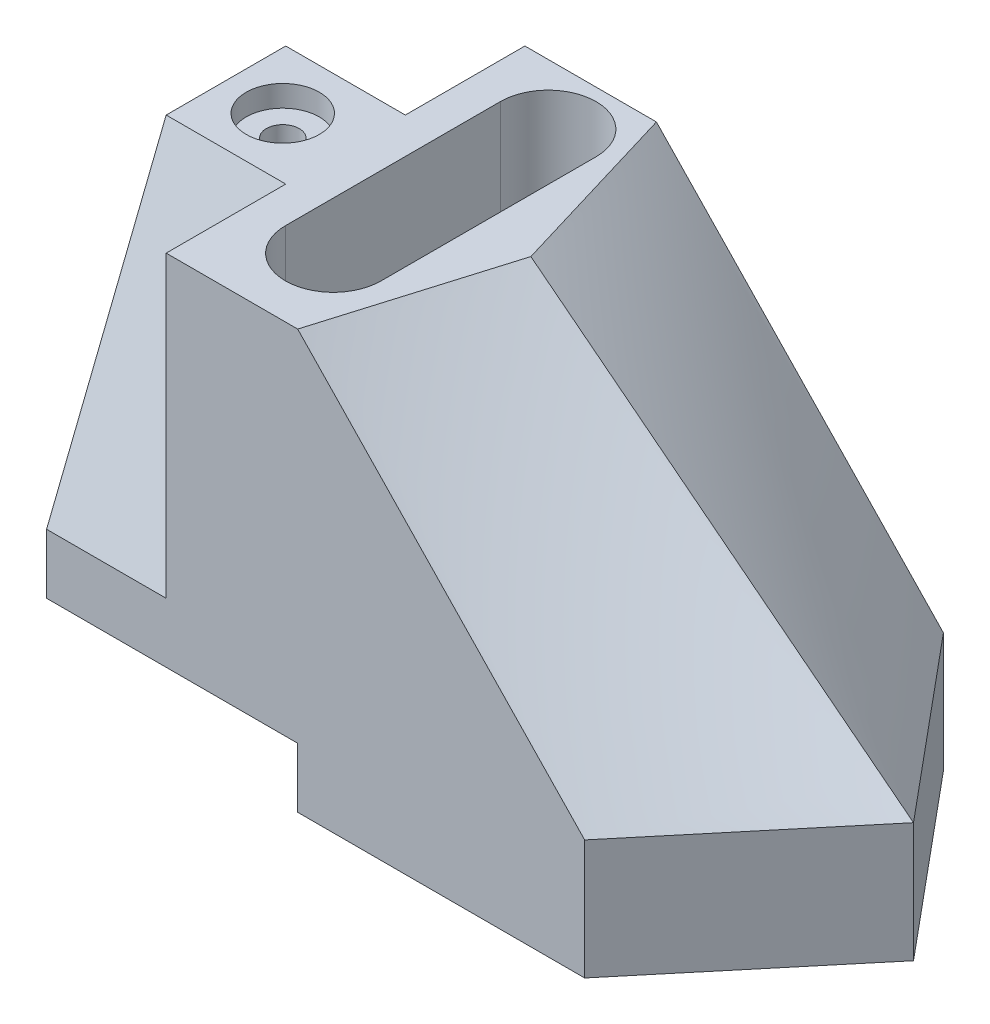
ISO-10303-21;
HEADER;
FILE_DESCRIPTION(('STEP AP214'),'2;1');
FILE_NAME('part.step','',(''),(''),'','','');
FILE_SCHEMA(('AUTOMOTIVE_DESIGN { 1 0 10303 214 1 1 1 1 }'));
ENDSEC;
DATA;
#1=APPLICATION_CONTEXT('core data for automotive mechanical design processes');
#2=APPLICATION_PROTOCOL_DEFINITION('international standard','automotive_design',2000,#1);
#3=PRODUCT_CONTEXT('',#1,'mechanical');
#4=PRODUCT('Part','Part','',(#3));
#5=PRODUCT_RELATED_PRODUCT_CATEGORY('part','',(#4));
#6=PRODUCT_DEFINITION_FORMATION('','',#4);
#7=PRODUCT_DEFINITION_CONTEXT('part definition',#1,'design');
#8=PRODUCT_DEFINITION('design','',#6,#7);
#9=PRODUCT_DEFINITION_SHAPE('','',#8);
#10=(LENGTH_UNIT() NAMED_UNIT(*) SI_UNIT(.MILLI.,.METRE.));
#11=(NAMED_UNIT(*) PLANE_ANGLE_UNIT() SI_UNIT($,.RADIAN.));
#12=(NAMED_UNIT(*) SI_UNIT($,.STERADIAN.) SOLID_ANGLE_UNIT());
#13=UNCERTAINTY_MEASURE_WITH_UNIT(LENGTH_MEASURE(1.E-05),#10,'distance_accuracy_value','');
#14=(GEOMETRIC_REPRESENTATION_CONTEXT(3) GLOBAL_UNCERTAINTY_ASSIGNED_CONTEXT((#13)) GLOBAL_UNIT_ASSIGNED_CONTEXT((#10,
#11,#12)) REPRESENTATION_CONTEXT('',''));
#15=CARTESIAN_POINT('',(0.,0.,0.));
#16=DIRECTION('',(0.,0.,1.));
#17=DIRECTION('',(1.,0.,0.));
#18=AXIS2_PLACEMENT_3D('',#15,#16,#17);
#19=CARTESIAN_POINT('',(0.,13.1034482758621,32.7586206896553));
#20=DIRECTION('',(0.,-0.371390676354103,-0.928476690885259));
#21=DIRECTION('',(0.,0.92847669088526,-0.371390676354104));
#22=AXIS2_PLACEMENT_3D('',#19,#20,#21);
#23=PLANE('',#22);
#24=DIRECTION('',(0.,-0.92847669088526,0.371390676354104));
#25=VECTOR('',#24,1.);
#26=CARTESIAN_POINT('',(-94.9999999999999,13.1034482758621,32.7586206896553));
#27=LINE('',#26,#25);
#28=CARTESIAN_POINT('',(-94.9999999999999,70.,10.0000000000002));
#29=VERTEX_POINT('',#28);
#30=CARTESIAN_POINT('',(-94.9999999999999,20.,30.0000000000002));
#31=VERTEX_POINT('',#30);
#32=EDGE_CURVE('E336',#29,#31,#27,.T.);
#33=ORIENTED_EDGE('',*,*,#32,.F.);
#34=DIRECTION('',(1.,0.,0.));
#35=VECTOR('',#34,1.);
#36=CARTESIAN_POINT('',(-115.,70.,10.0000000000002));
#37=LINE('',#36,#35);
#38=CARTESIAN_POINT('',(-115.,70.,10.0000000000002));
#39=VERTEX_POINT('',#38);
#40=EDGE_CURVE('E435',#39,#29,#37,.T.);
#41=ORIENTED_EDGE('',*,*,#40,.F.);
#42=DIRECTION('',(0.,0.928476690885259,-0.371390676354104));
#43=VECTOR('',#42,1.);
#44=CARTESIAN_POINT('',(-115.,20.,30.0000000000002));
#45=LINE('',#44,#43);
#46=CARTESIAN_POINT('',(-115.,20.,30.0000000000002));
#47=VERTEX_POINT('',#46);
#48=EDGE_CURVE('E339',#47,#39,#45,.T.);
#49=ORIENTED_EDGE('',*,*,#48,.F.);
#50=DIRECTION('',(-1.,0.,0.));
#51=VECTOR('',#50,1.);
#52=CARTESIAN_POINT('',(-24.9999999999999,20.,30.0000000000002));
#53=LINE('',#52,#51);
#54=EDGE_CURVE('E468',#31,#47,#53,.T.);
#55=ORIENTED_EDGE('',*,*,#54,.F.);
#56=EDGE_LOOP('',(#33,#41,#49,#55));
#57=FACE_BOUND('',#56,.T.);
#58=ADVANCED_FACE('F93',(#57),#23,.F.);
#59=CARTESIAN_POINT('',(0.,13.103448275862,-32.758620689655));
#60=DIRECTION('',(0.,-0.371390676354104,0.928476690885259));
#61=DIRECTION('',(0.,-0.928476690885259,-0.371390676354104));
#62=AXIS2_PLACEMENT_3D('',#59,#60,#61);
#63=PLANE('',#62);
#64=DIRECTION('',(0.,0.928476690885259,0.371390676354104));
#65=VECTOR('',#64,1.);
#66=CARTESIAN_POINT('',(-94.9999999999999,13.103448275862,-32.758620689655));
#67=LINE('',#66,#65);
#68=CARTESIAN_POINT('',(-94.9999999999999,20.,-29.9999999999998));
#69=VERTEX_POINT('',#68);
#70=CARTESIAN_POINT('',(-94.9999999999999,70.,-9.99999999999981));
#71=VERTEX_POINT('',#70);
#72=EDGE_CURVE('E12',#69,#71,#67,.T.);
#73=ORIENTED_EDGE('',*,*,#72,.F.);
#74=DIRECTION('',(1.,0.,0.));
#75=VECTOR('',#74,1.);
#76=CARTESIAN_POINT('',(-115.,20.,-29.9999999999998));
#77=LINE('',#76,#75);
#78=CARTESIAN_POINT('',(-115.,20.,-29.9999999999998));
#79=VERTEX_POINT('',#78);
#80=EDGE_CURVE('E473',#79,#69,#77,.T.);
#81=ORIENTED_EDGE('',*,*,#80,.F.);
#82=DIRECTION('',(0.,0.928476690885259,0.371390676354104));
#83=VECTOR('',#82,1.);
#84=CARTESIAN_POINT('',(-115.,20.,-29.9999999999998));
#85=LINE('',#84,#83);
#86=CARTESIAN_POINT('',(-115.,70.,-9.9999999999998));
#87=VERTEX_POINT('',#86);
#88=EDGE_CURVE('E344',#79,#87,#85,.T.);
#89=ORIENTED_EDGE('',*,*,#88,.T.);
#90=DIRECTION('',(-1.,0.,0.));
#91=VECTOR('',#90,1.);
#92=CARTESIAN_POINT('',(-94.9999999999999,70.,-9.99999999999981));
#93=LINE('',#92,#91);
#94=EDGE_CURVE('E98',#71,#87,#93,.T.);
#95=ORIENTED_EDGE('',*,*,#94,.F.);
#96=EDGE_LOOP('',(#73,#81,#89,#95));
#97=FACE_BOUND('',#96,.T.);
#98=ADVANCED_FACE('F362',(#97),#63,.F.);
#99=CARTESIAN_POINT('',(0.,70.,0.));
#100=DIRECTION('',(0.,-1.,0.));
#101=DIRECTION('',(0.,0.,-1.));
#102=AXIS2_PLACEMENT_3D('',#99,#100,#101);
#103=PLANE('',#102);
#104=CARTESIAN_POINT('',(-105.49695016561,70.,0.));
#105=DIRECTION('',(0.,1.,0.));
#106=DIRECTION('',(0.,0.,1.));
#107=AXIS2_PLACEMENT_3D('',#104,#105,#106);
#108=CIRCLE('',#107,6.11999995199999);
#109=CARTESIAN_POINT('',(-105.49695016561,70.,6.11999995199999));
#110=VERTEX_POINT('',#109);
#111=EDGE_CURVE('E885',#110,#110,#108,.T.);
#112=ORIENTED_EDGE('',*,*,#111,.F.);
#113=EDGE_LOOP('',(#112));
#114=FACE_BOUND('',#113,.T.);
#115=CARTESIAN_POINT('',(-80.9999999999999,70.,16.0525342275668));
#116=DIRECTION('',(0.,1.,0.));
#117=DIRECTION('',(0.,0.,1.));
#118=AXIS2_PLACEMENT_3D('',#115,#116,#117);
#119=CIRCLE('',#118,7.99999999999999);
#120=CARTESIAN_POINT('',(-88.9999999999999,70.,16.0525342275668));
#121=VERTEX_POINT('',#120);
#122=CARTESIAN_POINT('',(-72.9999999999999,70.,16.0525342275668));
#123=VERTEX_POINT('',#122);
#124=EDGE_CURVE('E320',#121,#123,#119,.T.);
#125=ORIENTED_EDGE('',*,*,#124,.F.);
#126=DIRECTION('',(0.,0.,1.));
#127=VECTOR('',#126,1.);
#128=CARTESIAN_POINT('',(-88.9999999999999,70.,0.));
#129=LINE('',#128,#127);
#130=CARTESIAN_POINT('',(-88.9999999999999,70.,-19.9033630066877));
#131=VERTEX_POINT('',#130);
#132=EDGE_CURVE('E120',#131,#121,#129,.T.);
#133=ORIENTED_EDGE('',*,*,#132,.F.);
#134=CARTESIAN_POINT('',(-80.9999999999999,70.,-19.9033630066877));
#135=DIRECTION('',(0.,1.,0.));
#136=DIRECTION('',(0.,0.,1.));
#137=AXIS2_PLACEMENT_3D('',#134,#135,#136);
#138=CIRCLE('',#137,7.99999999999999);
#139=CARTESIAN_POINT('',(-72.9999999999999,70.,-19.9033630066877));
#140=VERTEX_POINT('',#139);
#141=EDGE_CURVE('E299',#140,#131,#138,.T.);
#142=ORIENTED_EDGE('',*,*,#141,.F.);
#143=DIRECTION('',(0.,0.,-1.));
#144=VECTOR('',#143,1.);
#145=CARTESIAN_POINT('',(-72.9999999999999,70.,0.));
#146=LINE('',#145,#144);
#147=EDGE_CURVE('E323',#123,#140,#146,.T.);
#148=ORIENTED_EDGE('',*,*,#147,.F.);
#149=EDGE_LOOP('',(#125,#133,#142,#148));
#150=FACE_BOUND('',#149,.T.);
#151=DIRECTION('',(0.,0.,1.));
#152=VECTOR('',#151,1.);
#153=CARTESIAN_POINT('',(-94.9999999999999,70.,-29.9999999999998));
#154=LINE('',#153,#152);
#155=CARTESIAN_POINT('',(-94.9999999999999,70.,-29.9999999999998));
#156=VERTEX_POINT('',#155);
#157=EDGE_CURVE('E493',#156,#71,#154,.T.);
#158=ORIENTED_EDGE('',*,*,#157,.T.);
#159=ORIENTED_EDGE('',*,*,#94,.T.);
#160=DIRECTION('',(0.,0.,1.));
#161=VECTOR('',#160,1.);
#162=CARTESIAN_POINT('',(-115.,70.,-9.9999999999998));
#163=LINE('',#162,#161);
#164=EDGE_CURVE('E348',#87,#39,#163,.T.);
#165=ORIENTED_EDGE('',*,*,#164,.T.);
#166=ORIENTED_EDGE('',*,*,#40,.T.);
#167=CARTESIAN_POINT('',(-94.9999999999999,70.,30.0000000000002));
#168=VERTEX_POINT('',#167);
#169=EDGE_CURVE('E605',#29,#168,#154,.T.);
#170=ORIENTED_EDGE('',*,*,#169,.T.);
#171=DIRECTION('',(1.,0.,0.));
#172=VECTOR('',#171,1.);
#173=CARTESIAN_POINT('',(-94.9999999999999,70.,30.0000000000002));
#174=LINE('',#173,#172);
#175=CARTESIAN_POINT('',(-72.9999999999999,70.,30.0000000000002));
#176=VERTEX_POINT('',#175);
#177=EDGE_CURVE('E472',#168,#176,#174,.T.);
#178=ORIENTED_EDGE('',*,*,#177,.T.);
#179=DIRECTION('',(0.287347885566345,0.,-0.957826285221152));
#180=VECTOR('',#179,1.);
#181=CARTESIAN_POINT('',(-72.9999999999999,70.,30.0000000000002));
#182=LINE('',#181,#180);
#183=CARTESIAN_POINT('',(-63.9999999999999,70.,1.97758476261356E-13));
#184=VERTEX_POINT('',#183);
#185=EDGE_CURVE('E554',#176,#184,#182,.T.);
#186=ORIENTED_EDGE('',*,*,#185,.T.);
#187=DIRECTION('',(-0.287347885566345,0.,-0.957826285221152));
#188=VECTOR('',#187,1.);
#189=CARTESIAN_POINT('',(-63.9999999999999,70.,1.93421667571414E-13));
#190=LINE('',#189,#188);
#191=CARTESIAN_POINT('',(-72.9999999999999,70.,-29.9999999999998));
#192=VERTEX_POINT('',#191);
#193=EDGE_CURVE('E543',#184,#192,#190,.T.);
#194=ORIENTED_EDGE('',*,*,#193,.T.);
#195=DIRECTION('',(-1.,0.,0.));
#196=VECTOR('',#195,1.);
#197=CARTESIAN_POINT('',(-72.9999999999999,70.,-29.9999999999998));
#198=LINE('',#197,#196);
#199=EDGE_CURVE('E553',#192,#156,#198,.T.);
#200=ORIENTED_EDGE('',*,*,#199,.T.);
#201=EDGE_LOOP('',(#158,#159,#165,#166,#170,#178,#186,#194,#200));
#202=FACE_BOUND('',#201,.T.);
#203=ADVANCED_FACE('F95',(#114,#150,#202),#103,.F.);
#204=CARTESIAN_POINT('',(-24.9999999999999,20.,30.0000000000002));
#205=CARTESIAN_POINT('',(-72.9999999999999,70.,30.0000000000002));
#206=CARTESIAN_POINT('',(0.,20.,0.));
#207=CARTESIAN_POINT('',(-63.9999999999999,70.,1.97758476261356E-13));
#208=B_SPLINE_SURFACE_WITH_KNOTS('',1,1,((#204,#205),(#206,#207)),.UNSPECIFIED.,.F.,.F.,.F.,(2,
2),(2,2),(0.,1.),(0.,1.),.UNSPECIFIED.);
#209=DIRECTION('',(0.640184399664476,0.,-0.768221279597379));
#210=VECTOR('',#209,1.);
#211=CARTESIAN_POINT('',(0.,20.,0.));
#212=LINE('',#211,#210);
#213=CARTESIAN_POINT('',(-24.9999999999999,20.,30.0000000000002));
#214=VERTEX_POINT('',#213);
#215=CARTESIAN_POINT('',(0.,20.,0.));
#216=VERTEX_POINT('',#215);
#217=EDGE_CURVE('E412',#214,#216,#212,.T.);
#218=DIRECTION('',(-0.788024373724563,0.615644041972316,0.));
#219=VECTOR('',#218,1.);
#220=CARTESIAN_POINT('',(-32.,45.,0.));
#221=LINE('',#220,#219);
#222=EDGE_CURVE('E428',#216,#184,#221,.T.);
#223=DIRECTION('',(0.692531828189713,-0.721387321030952,0.));
#224=VECTOR('',#223,1.);
#225=CARTESIAN_POINT('',(-48.9999999999999,45.,30.0000000000002));
#226=LINE('',#225,#224);
#227=EDGE_CURVE('E492',#176,#214,#226,.T.);
#228=ORIENTED_EDGE('',*,*,#217,.T.);
#229=ORIENTED_EDGE('',*,*,#222,.T.);
#230=ORIENTED_EDGE('',*,*,#185,.F.);
#231=ORIENTED_EDGE('',*,*,#227,.T.);
#232=EDGE_LOOP('',(#228,#229,#230,#231));
#233=FACE_BOUND('',#232,.T.);
#234=ADVANCED_FACE('F508',(#233),#208,.T.);
#235=CARTESIAN_POINT('',(0.,20.,0.));
#236=CARTESIAN_POINT('',(-63.9999999999999,70.,1.93421667571414E-13));
#237=CARTESIAN_POINT('',(-24.9999999999999,20.,-29.9999999999998));
#238=CARTESIAN_POINT('',(-72.9999999999999,70.,-29.9999999999998));
#239=B_SPLINE_SURFACE_WITH_KNOTS('',1,1,((#235,#236),(#237,#238)),.UNSPECIFIED.,.F.,.F.,.F.,(2,
2),(2,2),(0.,1.),(0.,1.),.UNSPECIFIED.);
#240=DIRECTION('',(-0.640184399664481,0.,-0.768221279597375));
#241=VECTOR('',#240,1.);
#242=CARTESIAN_POINT('',(-24.9999999999999,20.,-29.9999999999998));
#243=LINE('',#242,#241);
#244=CARTESIAN_POINT('',(-24.9999999999999,20.,-29.9999999999998));
#245=VERTEX_POINT('',#244);
#246=EDGE_CURVE('E104',#216,#245,#243,.T.);
#247=DIRECTION('',(-0.692531828189713,0.721387321030952,0.));
#248=VECTOR('',#247,1.);
#249=CARTESIAN_POINT('',(-48.9999999999999,45.,-29.9999999999998));
#250=LINE('',#249,#248);
#251=EDGE_CURVE('E489',#245,#192,#250,.T.);
#252=ORIENTED_EDGE('',*,*,#246,.T.);
#253=ORIENTED_EDGE('',*,*,#251,.T.);
#254=ORIENTED_EDGE('',*,*,#193,.F.);
#255=ORIENTED_EDGE('',*,*,#222,.F.);
#256=EDGE_LOOP('',(#252,#253,#254,#255));
#257=FACE_BOUND('',#256,.T.);
#258=ADVANCED_FACE('F519',(#257),#239,.T.);
#259=CARTESIAN_POINT('',(-72.9999999999999,20.,30.0000000000002));
#260=DIRECTION('',(0.,0.,1.));
#261=DIRECTION('',(1.,0.,0.));
#262=AXIS2_PLACEMENT_3D('',#259,#260,#261);
#263=PLANE('',#262);
#264=DIRECTION('',(0.,1.,0.));
#265=VECTOR('',#264,1.);
#266=CARTESIAN_POINT('',(-72.9999999999999,0.,30.0000000000002));
#267=LINE('',#266,#265);
#268=CARTESIAN_POINT('',(-72.9999999999999,0.,30.0000000000002));
#269=VERTEX_POINT('',#268);
#270=CARTESIAN_POINT('',(-72.9999999999999,10.,30.0000000000002));
#271=VERTEX_POINT('',#270);
#272=EDGE_CURVE('E260',#269,#271,#267,.T.);
#273=ORIENTED_EDGE('',*,*,#272,.F.);
#274=DIRECTION('',(1.,0.,0.));
#275=VECTOR('',#274,1.);
#276=CARTESIAN_POINT('',(-24.9999999999999,0.,30.0000000000002));
#277=LINE('',#276,#275);
#278=CARTESIAN_POINT('',(-24.9999999999999,0.,30.0000000000002));
#279=VERTEX_POINT('',#278);
#280=EDGE_CURVE('E479',#269,#279,#277,.T.);
#281=ORIENTED_EDGE('',*,*,#280,.T.);
#282=DIRECTION('',(0.,-1.,0.));
#283=VECTOR('',#282,1.);
#284=CARTESIAN_POINT('',(-24.9999999999999,149.711217710728,30.0000000000002));
#285=LINE('',#284,#283);
#286=EDGE_CURVE('E405',#214,#279,#285,.T.);
#287=ORIENTED_EDGE('',*,*,#286,.F.);
#288=ORIENTED_EDGE('',*,*,#227,.F.);
#289=ORIENTED_EDGE('',*,*,#177,.F.);
#290=DIRECTION('',(0.,-1.,0.));
#291=VECTOR('',#290,1.);
#292=CARTESIAN_POINT('',(-94.9999999999999,133.906181234682,30.0000000000002));
#293=LINE('',#292,#291);
#294=EDGE_CURVE('E330',#168,#31,#293,.T.);
#295=ORIENTED_EDGE('',*,*,#294,.T.);
#296=ORIENTED_EDGE('',*,*,#54,.T.);
#297=DIRECTION('',(0.,-1.,0.));
#298=VECTOR('',#297,1.);
#299=CARTESIAN_POINT('',(-115.,149.711217710728,30.0000000000002));
#300=LINE('',#299,#298);
#301=CARTESIAN_POINT('',(-115.,10.,30.0000000000002));
#302=VERTEX_POINT('',#301);
#303=EDGE_CURVE('E457',#47,#302,#300,.T.);
#304=ORIENTED_EDGE('',*,*,#303,.T.);
#305=DIRECTION('',(1.,0.,0.));
#306=VECTOR('',#305,1.);
#307=CARTESIAN_POINT('',(0.,10.,29.9999999999999));
#308=LINE('',#307,#306);
#309=EDGE_CURVE('E112',#302,#271,#308,.T.);
#310=ORIENTED_EDGE('',*,*,#309,.T.);
#311=EDGE_LOOP('',(#273,#281,#287,#288,#289,#295,#296,#304,#310));
#312=FACE_BOUND('',#311,.T.);
#313=ADVANCED_FACE('F583',(#312),#263,.T.);
#314=CARTESIAN_POINT('',(-24.9999999999999,20.,-29.9999999999998));
#315=DIRECTION('',(0.,0.,-1.));
#316=DIRECTION('',(-1.,0.,0.));
#317=AXIS2_PLACEMENT_3D('',#314,#315,#316);
#318=PLANE('',#317);
#319=DIRECTION('',(0.,1.,0.));
#320=VECTOR('',#319,1.);
#321=CARTESIAN_POINT('',(-72.9999999999999,0.,-29.9999999999998));
#322=LINE('',#321,#320);
#323=CARTESIAN_POINT('',(-72.9999999999999,0.,-29.9999999999998));
#324=VERTEX_POINT('',#323);
#325=CARTESIAN_POINT('',(-72.9999999999999,10.,-29.9999999999998));
#326=VERTEX_POINT('',#325);
#327=EDGE_CURVE('E269',#324,#326,#322,.T.);
#328=ORIENTED_EDGE('',*,*,#327,.T.);
#329=DIRECTION('',(-1.,0.,0.));
#330=VECTOR('',#329,1.);
#331=CARTESIAN_POINT('',(0.,10.,-29.9999999999998));
#332=LINE('',#331,#330);
#333=CARTESIAN_POINT('',(-115.,10.,-29.9999999999998));
#334=VERTEX_POINT('',#333);
#335=EDGE_CURVE('E265',#326,#334,#332,.T.);
#336=ORIENTED_EDGE('',*,*,#335,.T.);
#337=DIRECTION('',(0.,-1.,0.));
#338=VECTOR('',#337,1.);
#339=CARTESIAN_POINT('',(-115.,149.711217710728,-29.9999999999998));
#340=LINE('',#339,#338);
#341=EDGE_CURVE('E449',#79,#334,#340,.T.);
#342=ORIENTED_EDGE('',*,*,#341,.F.);
#343=ORIENTED_EDGE('',*,*,#80,.T.);
#344=DIRECTION('',(0.,-1.,0.));
#345=VECTOR('',#344,1.);
#346=CARTESIAN_POINT('',(-94.9999999999999,133.906181234682,-29.9999999999998));
#347=LINE('',#346,#345);
#348=EDGE_CURVE('E340',#156,#69,#347,.T.);
#349=ORIENTED_EDGE('',*,*,#348,.F.);
#350=ORIENTED_EDGE('',*,*,#199,.F.);
#351=ORIENTED_EDGE('',*,*,#251,.F.);
#352=DIRECTION('',(0.,-1.,0.));
#353=VECTOR('',#352,1.);
#354=CARTESIAN_POINT('',(-24.9999999999999,149.711217710728,-29.9999999999998));
#355=LINE('',#354,#353);
#356=CARTESIAN_POINT('',(-24.9999999999999,0.,-29.9999999999998));
#357=VERTEX_POINT('',#356);
#358=EDGE_CURVE('E406',#245,#357,#355,.T.);
#359=ORIENTED_EDGE('',*,*,#358,.T.);
#360=DIRECTION('',(-1.,0.,0.));
#361=VECTOR('',#360,1.);
#362=CARTESIAN_POINT('',(-115.,0.,-29.9999999999998));
#363=LINE('',#362,#361);
#364=EDGE_CURVE('E462',#357,#324,#363,.T.);
#365=ORIENTED_EDGE('',*,*,#364,.T.);
#366=EDGE_LOOP('',(#328,#336,#342,#343,#349,#350,#351,#359,#365));
#367=FACE_BOUND('',#366,.T.);
#368=ADVANCED_FACE('F378',(#367),#318,.T.);
#369=CARTESIAN_POINT('',(0.,0.,0.));
#370=DIRECTION('',(0.,-1.,0.));
#371=DIRECTION('',(0.,0.,-1.));
#372=AXIS2_PLACEMENT_3D('',#369,#370,#371);
#373=PLANE('',#372);
#374=DIRECTION('',(0.,0.,-1.));
#375=VECTOR('',#374,1.);
#376=CARTESIAN_POINT('',(-72.9999999999999,0.,0.));
#377=LINE('',#376,#375);
#378=EDGE_CURVE('E258',#269,#324,#377,.T.);
#379=ORIENTED_EDGE('',*,*,#378,.T.);
#380=ORIENTED_EDGE('',*,*,#364,.F.);
#381=DIRECTION('',(-0.640184399664481,0.,-0.768221279597375));
#382=VECTOR('',#381,1.);
#383=CARTESIAN_POINT('',(-24.9999999999999,0.,-29.9999999999998));
#384=LINE('',#383,#382);
#385=CARTESIAN_POINT('',(0.,0.,0.));
#386=VERTEX_POINT('',#385);
#387=EDGE_CURVE('E484',#386,#357,#384,.T.);
#388=ORIENTED_EDGE('',*,*,#387,.F.);
#389=DIRECTION('',(0.640184399664476,0.,-0.768221279597379));
#390=VECTOR('',#389,1.);
#391=CARTESIAN_POINT('',(0.,0.,0.));
#392=LINE('',#391,#390);
#393=EDGE_CURVE('E481',#279,#386,#392,.T.);
#394=ORIENTED_EDGE('',*,*,#393,.F.);
#395=ORIENTED_EDGE('',*,*,#280,.F.);
#396=EDGE_LOOP('',(#379,#380,#388,#394,#395));
#397=FACE_BOUND('',#396,.T.);
#398=ADVANCED_FACE('F374',(#397),#373,.T.);
#399=CARTESIAN_POINT('',(-115.,149.711217710728,30.0000000000002));
#400=DIRECTION('',(1.,0.,0.));
#401=DIRECTION('',(0.,0.,-1.));
#402=AXIS2_PLACEMENT_3D('',#399,#400,#401);
#403=PLANE('',#402);
#404=ORIENTED_EDGE('',*,*,#341,.T.);
#405=DIRECTION('',(0.,0.,1.));
#406=VECTOR('',#405,1.);
#407=CARTESIAN_POINT('',(-115.,10.,0.));
#408=LINE('',#407,#406);
#409=EDGE_CURVE('E261',#334,#302,#408,.T.);
#410=ORIENTED_EDGE('',*,*,#409,.T.);
#411=ORIENTED_EDGE('',*,*,#303,.F.);
#412=ORIENTED_EDGE('',*,*,#48,.T.);
#413=ORIENTED_EDGE('',*,*,#164,.F.);
#414=ORIENTED_EDGE('',*,*,#88,.F.);
#415=EDGE_LOOP('',(#404,#410,#411,#412,#413,#414));
#416=FACE_BOUND('',#415,.T.);
#417=ADVANCED_FACE('F377',(#416),#403,.F.);
#418=CARTESIAN_POINT('',(-24.9999999999999,149.711217710728,-29.9999999999998));
#419=DIRECTION('',(-0.768221279597375,0.,0.640184399664481));
#420=DIRECTION('',(0.640184399664481,0.,0.768221279597375));
#421=AXIS2_PLACEMENT_3D('',#418,#419,#420);
#422=PLANE('',#421);
#423=ORIENTED_EDGE('',*,*,#358,.F.);
#424=ORIENTED_EDGE('',*,*,#246,.F.);
#425=DIRECTION('',(0.,-1.,0.));
#426=VECTOR('',#425,1.);
#427=CARTESIAN_POINT('',(0.,149.711217710728,0.));
#428=LINE('',#427,#426);
#429=EDGE_CURVE('E398',#216,#386,#428,.T.);
#430=ORIENTED_EDGE('',*,*,#429,.T.);
#431=ORIENTED_EDGE('',*,*,#387,.T.);
#432=EDGE_LOOP('',(#423,#424,#430,#431));
#433=FACE_BOUND('',#432,.T.);
#434=ADVANCED_FACE('F382',(#433),#422,.F.);
#435=CARTESIAN_POINT('',(0.,149.711217710728,0.));
#436=DIRECTION('',(-0.768221279597379,0.,-0.640184399664476));
#437=DIRECTION('',(-0.640184399664476,0.,0.768221279597379));
#438=AXIS2_PLACEMENT_3D('',#435,#436,#437);
#439=PLANE('',#438);
#440=ORIENTED_EDGE('',*,*,#429,.F.);
#441=ORIENTED_EDGE('',*,*,#217,.F.);
#442=ORIENTED_EDGE('',*,*,#286,.T.);
#443=ORIENTED_EDGE('',*,*,#393,.T.);
#444=EDGE_LOOP('',(#440,#441,#442,#443));
#445=FACE_BOUND('',#444,.T.);
#446=ADVANCED_FACE('F387',(#445),#439,.F.);
#447=CARTESIAN_POINT('',(-94.9999999999999,133.906181234682,0.));
#448=DIRECTION('',(1.,0.,0.));
#449=DIRECTION('',(0.,0.,-1.));
#450=AXIS2_PLACEMENT_3D('',#447,#448,#449);
#451=PLANE('',#450);
#452=ORIENTED_EDGE('',*,*,#348,.T.);
#453=ORIENTED_EDGE('',*,*,#72,.T.);
#454=ORIENTED_EDGE('',*,*,#157,.F.);
#455=EDGE_LOOP('',(#452,#453,#454));
#456=FACE_BOUND('',#455,.T.);
#457=ADVANCED_FACE('F594',(#456),#451,.F.);
#458=ORIENTED_EDGE('',*,*,#169,.F.);
#459=ORIENTED_EDGE('',*,*,#32,.T.);
#460=ORIENTED_EDGE('',*,*,#294,.F.);
#461=EDGE_LOOP('',(#458,#459,#460));
#462=FACE_BOUND('',#461,.T.);
#463=ADVANCED_FACE('F614',(#462),#451,.F.);
#464=CARTESIAN_POINT('',(-88.9999999999999,50.,0.));
#465=DIRECTION('',(-1.,0.,0.));
#466=DIRECTION('',(0.,0.,1.));
#467=AXIS2_PLACEMENT_3D('',#464,#465,#466);
#468=PLANE('',#467);
#469=ORIENTED_EDGE('',*,*,#132,.T.);
#470=DIRECTION('',(0.,1.,0.));
#471=VECTOR('',#470,1.);
#472=CARTESIAN_POINT('',(-88.9999999999999,50.,16.0525342275668));
#473=LINE('',#472,#471);
#474=CARTESIAN_POINT('',(-88.9999999999999,50.,16.0525342275668));
#475=VERTEX_POINT('',#474);
#476=EDGE_CURVE('E318',#475,#121,#473,.T.);
#477=ORIENTED_EDGE('',*,*,#476,.F.);
#478=DIRECTION('',(0.,0.,1.));
#479=VECTOR('',#478,1.);
#480=CARTESIAN_POINT('',(-88.9999999999999,50.,0.));
#481=LINE('',#480,#479);
#482=CARTESIAN_POINT('',(-88.9999999999999,50.,-19.9033630066877));
#483=VERTEX_POINT('',#482);
#484=EDGE_CURVE('E306',#483,#475,#481,.T.);
#485=ORIENTED_EDGE('',*,*,#484,.F.);
#486=DIRECTION('',(0.,1.,0.));
#487=VECTOR('',#486,1.);
#488=CARTESIAN_POINT('',(-88.9999999999999,50.,-19.9033630066877));
#489=LINE('',#488,#487);
#490=EDGE_CURVE('E328',#483,#131,#489,.T.);
#491=ORIENTED_EDGE('',*,*,#490,.T.);
#492=EDGE_LOOP('',(#469,#477,#485,#491));
#493=FACE_BOUND('',#492,.T.);
#494=ADVANCED_FACE('F681',(#493),#468,.F.);
#495=CARTESIAN_POINT('',(-80.9999999999999,50.,-19.9033630066877));
#496=DIRECTION('',(0.,1.,0.));
#497=DIRECTION('',(0.,0.,1.));
#498=AXIS2_PLACEMENT_3D('',#495,#496,#497);
#499=CYLINDRICAL_SURFACE('',#498,7.99999999999999);
#500=ORIENTED_EDGE('',*,*,#141,.T.);
#501=ORIENTED_EDGE('',*,*,#490,.F.);
#502=CARTESIAN_POINT('',(-80.9999999999999,50.,-19.9033630066877));
#503=DIRECTION('',(0.,1.,0.));
#504=DIRECTION('',(0.,0.,1.));
#505=AXIS2_PLACEMENT_3D('',#502,#503,#504);
#506=CIRCLE('',#505,7.99999999999999);
#507=CARTESIAN_POINT('',(-72.9999999999999,50.,-19.9033630066877));
#508=VERTEX_POINT('',#507);
#509=EDGE_CURVE('E315',#508,#483,#506,.T.);
#510=ORIENTED_EDGE('',*,*,#509,.F.);
#511=DIRECTION('',(0.,1.,0.));
#512=VECTOR('',#511,1.);
#513=CARTESIAN_POINT('',(-72.9999999999999,50.,-19.9033630066877));
#514=LINE('',#513,#512);
#515=EDGE_CURVE('E331',#508,#140,#514,.T.);
#516=ORIENTED_EDGE('',*,*,#515,.T.);
#517=EDGE_LOOP('',(#500,#501,#510,#516));
#518=FACE_BOUND('',#517,.T.);
#519=ADVANCED_FACE('F687',(#518),#499,.F.);
#520=CARTESIAN_POINT('',(-72.9999999999999,50.,0.));
#521=DIRECTION('',(1.,0.,0.));
#522=DIRECTION('',(0.,0.,-1.));
#523=AXIS2_PLACEMENT_3D('',#520,#521,#522);
#524=PLANE('',#523);
#525=ORIENTED_EDGE('',*,*,#147,.T.);
#526=ORIENTED_EDGE('',*,*,#515,.F.);
#527=DIRECTION('',(0.,0.,-1.));
#528=VECTOR('',#527,1.);
#529=CARTESIAN_POINT('',(-72.9999999999999,50.,0.));
#530=LINE('',#529,#528);
#531=CARTESIAN_POINT('',(-72.9999999999999,50.,16.0525342275668));
#532=VERTEX_POINT('',#531);
#533=EDGE_CURVE('E312',#532,#508,#530,.T.);
#534=ORIENTED_EDGE('',*,*,#533,.F.);
#535=DIRECTION('',(0.,1.,0.));
#536=VECTOR('',#535,1.);
#537=CARTESIAN_POINT('',(-72.9999999999999,50.,16.0525342275668));
#538=LINE('',#537,#536);
#539=EDGE_CURVE('E333',#532,#123,#538,.T.);
#540=ORIENTED_EDGE('',*,*,#539,.T.);
#541=EDGE_LOOP('',(#525,#526,#534,#540));
#542=FACE_BOUND('',#541,.T.);
#543=ADVANCED_FACE('F694',(#542),#524,.F.);
#544=CARTESIAN_POINT('',(-80.9999999999999,50.,16.0525342275668));
#545=DIRECTION('',(0.,1.,0.));
#546=DIRECTION('',(0.,0.,1.));
#547=AXIS2_PLACEMENT_3D('',#544,#545,#546);
#548=CYLINDRICAL_SURFACE('',#547,7.99999999999999);
#549=ORIENTED_EDGE('',*,*,#124,.T.);
#550=ORIENTED_EDGE('',*,*,#539,.F.);
#551=CARTESIAN_POINT('',(-80.9999999999999,50.,16.0525342275668));
#552=DIRECTION('',(0.,1.,0.));
#553=DIRECTION('',(0.,0.,1.));
#554=AXIS2_PLACEMENT_3D('',#551,#552,#553);
#555=CIRCLE('',#554,7.99999999999999);
#556=EDGE_CURVE('E309',#475,#532,#555,.T.);
#557=ORIENTED_EDGE('',*,*,#556,.F.);
#558=ORIENTED_EDGE('',*,*,#476,.T.);
#559=EDGE_LOOP('',(#549,#550,#557,#558));
#560=FACE_BOUND('',#559,.T.);
#561=ADVANCED_FACE('F702',(#560),#548,.F.);
#562=CARTESIAN_POINT('',(0.,50.,0.));
#563=DIRECTION('',(0.,1.,0.));
#564=DIRECTION('',(0.,0.,1.));
#565=AXIS2_PLACEMENT_3D('',#562,#563,#564);
#566=PLANE('',#565);
#567=CARTESIAN_POINT('',(-80.9999999999999,50.,-19.9033630066877));
#568=DIRECTION('',(0.,1.,0.));
#569=DIRECTION('',(0.,0.,1.));
#570=AXIS2_PLACEMENT_3D('',#567,#568,#569);
#571=CIRCLE('',#570,2.99999999999999);
#572=CARTESIAN_POINT('',(-77.9999999999999,50.,-19.9033630066877));
#573=VERTEX_POINT('',#572);
#574=CARTESIAN_POINT('',(-83.9999999999999,50.,-19.9033630066877));
#575=VERTEX_POINT('',#574);
#576=EDGE_CURVE('E296',#573,#575,#571,.T.);
#577=ORIENTED_EDGE('',*,*,#576,.F.);
#578=DIRECTION('',(0.,0.,-1.));
#579=VECTOR('',#578,1.);
#580=CARTESIAN_POINT('',(-77.9999999999999,50.,0.));
#581=LINE('',#580,#579);
#582=CARTESIAN_POINT('',(-77.9999999999999,50.,16.0525342275668));
#583=VERTEX_POINT('',#582);
#584=EDGE_CURVE('E298',#583,#573,#581,.T.);
#585=ORIENTED_EDGE('',*,*,#584,.F.);
#586=CARTESIAN_POINT('',(-80.9999999999999,50.,16.0525342275668));
#587=DIRECTION('',(0.,1.,0.));
#588=DIRECTION('',(0.,0.,1.));
#589=AXIS2_PLACEMENT_3D('',#586,#587,#588);
#590=CIRCLE('',#589,3.);
#591=CARTESIAN_POINT('',(-83.9999999999999,50.,16.0525342275668));
#592=VERTEX_POINT('',#591);
#593=EDGE_CURVE('E302',#592,#583,#590,.T.);
#594=ORIENTED_EDGE('',*,*,#593,.F.);
#595=DIRECTION('',(0.,0.,1.));
#596=VECTOR('',#595,1.);
#597=CARTESIAN_POINT('',(-83.9999999999999,50.,0.));
#598=LINE('',#597,#596);
#599=EDGE_CURVE('E304',#575,#592,#598,.T.);
#600=ORIENTED_EDGE('',*,*,#599,.F.);
#601=EDGE_LOOP('',(#577,#585,#594,#600));
#602=FACE_BOUND('',#601,.T.);
#603=ORIENTED_EDGE('',*,*,#484,.T.);
#604=ORIENTED_EDGE('',*,*,#556,.T.);
#605=ORIENTED_EDGE('',*,*,#533,.T.);
#606=ORIENTED_EDGE('',*,*,#509,.T.);
#607=EDGE_LOOP('',(#603,#604,#605,#606));
#608=FACE_BOUND('',#607,.T.);
#609=ADVANCED_FACE('F710',(#602,#608),#566,.T.);
#610=CARTESIAN_POINT('',(-77.9999999999999,20.,0.));
#611=DIRECTION('',(1.,0.,0.));
#612=DIRECTION('',(0.,0.,-1.));
#613=AXIS2_PLACEMENT_3D('',#610,#611,#612);
#614=PLANE('',#613);
#615=ORIENTED_EDGE('',*,*,#584,.T.);
#616=DIRECTION('',(0.,1.,0.));
#617=VECTOR('',#616,1.);
#618=CARTESIAN_POINT('',(-77.9999999999999,20.,-19.9033630066877));
#619=LINE('',#618,#617);
#620=CARTESIAN_POINT('',(-77.9999999999999,20.,-19.9033630066877));
#621=VERTEX_POINT('',#620);
#622=EDGE_CURVE('E285',#621,#573,#619,.T.);
#623=ORIENTED_EDGE('',*,*,#622,.F.);
#624=DIRECTION('',(0.,0.,-1.));
#625=VECTOR('',#624,1.);
#626=CARTESIAN_POINT('',(-77.9999999999999,20.,0.));
#627=LINE('',#626,#625);
#628=CARTESIAN_POINT('',(-77.9999999999999,20.,16.0525342275668));
#629=VERTEX_POINT('',#628);
#630=EDGE_CURVE('E272',#629,#621,#627,.T.);
#631=ORIENTED_EDGE('',*,*,#630,.F.);
#632=DIRECTION('',(0.,1.,0.));
#633=VECTOR('',#632,1.);
#634=CARTESIAN_POINT('',(-77.9999999999999,20.,16.0525342275668));
#635=LINE('',#634,#633);
#636=EDGE_CURVE('E286',#629,#583,#635,.T.);
#637=ORIENTED_EDGE('',*,*,#636,.T.);
#638=EDGE_LOOP('',(#615,#623,#631,#637));
#639=FACE_BOUND('',#638,.T.);
#640=ADVANCED_FACE('F718',(#639),#614,.F.);
#641=CARTESIAN_POINT('',(-80.9999999999999,20.,16.0525342275668));
#642=DIRECTION('',(0.,1.,0.));
#643=DIRECTION('',(0.,0.,1.));
#644=AXIS2_PLACEMENT_3D('',#641,#642,#643);
#645=CYLINDRICAL_SURFACE('',#644,3.);
#646=ORIENTED_EDGE('',*,*,#593,.T.);
#647=ORIENTED_EDGE('',*,*,#636,.F.);
#648=CARTESIAN_POINT('',(-80.9999999999999,20.,16.0525342275668));
#649=DIRECTION('',(0.,1.,0.));
#650=DIRECTION('',(0.,0.,1.));
#651=AXIS2_PLACEMENT_3D('',#648,#649,#650);
#652=CIRCLE('',#651,3.);
#653=CARTESIAN_POINT('',(-83.9999999999999,20.,16.0525342275668));
#654=VERTEX_POINT('',#653);
#655=EDGE_CURVE('E282',#654,#629,#652,.T.);
#656=ORIENTED_EDGE('',*,*,#655,.F.);
#657=DIRECTION('',(0.,1.,0.));
#658=VECTOR('',#657,1.);
#659=CARTESIAN_POINT('',(-83.9999999999999,20.,16.0525342275668));
#660=LINE('',#659,#658);
#661=EDGE_CURVE('E289',#654,#592,#660,.T.);
#662=ORIENTED_EDGE('',*,*,#661,.T.);
#663=EDGE_LOOP('',(#646,#647,#656,#662));
#664=FACE_BOUND('',#663,.T.);
#665=ADVANCED_FACE('F726',(#664),#645,.F.);
#666=CARTESIAN_POINT('',(-83.9999999999999,20.,0.));
#667=DIRECTION('',(-1.,0.,0.));
#668=DIRECTION('',(0.,0.,1.));
#669=AXIS2_PLACEMENT_3D('',#666,#667,#668);
#670=PLANE('',#669);
#671=ORIENTED_EDGE('',*,*,#599,.T.);
#672=ORIENTED_EDGE('',*,*,#661,.F.);
#673=DIRECTION('',(0.,0.,1.));
#674=VECTOR('',#673,1.);
#675=CARTESIAN_POINT('',(-83.9999999999999,20.,0.));
#676=LINE('',#675,#674);
#677=CARTESIAN_POINT('',(-83.9999999999999,20.,-19.9033630066877));
#678=VERTEX_POINT('',#677);
#679=EDGE_CURVE('E279',#678,#654,#676,.T.);
#680=ORIENTED_EDGE('',*,*,#679,.F.);
#681=DIRECTION('',(0.,1.,0.));
#682=VECTOR('',#681,1.);
#683=CARTESIAN_POINT('',(-83.9999999999999,20.,-19.9033630066877));
#684=LINE('',#683,#682);
#685=EDGE_CURVE('E292',#678,#575,#684,.T.);
#686=ORIENTED_EDGE('',*,*,#685,.T.);
#687=EDGE_LOOP('',(#671,#672,#680,#686));
#688=FACE_BOUND('',#687,.T.);
#689=ADVANCED_FACE('F734',(#688),#670,.F.);
#690=CARTESIAN_POINT('',(-80.9999999999999,20.,-19.9033630066877));
#691=DIRECTION('',(0.,1.,0.));
#692=DIRECTION('',(0.,0.,1.));
#693=AXIS2_PLACEMENT_3D('',#690,#691,#692);
#694=CYLINDRICAL_SURFACE('',#693,2.99999999999999);
#695=ORIENTED_EDGE('',*,*,#576,.T.);
#696=ORIENTED_EDGE('',*,*,#685,.F.);
#697=CARTESIAN_POINT('',(-80.9999999999999,20.,-19.9033630066877));
#698=DIRECTION('',(0.,1.,0.));
#699=DIRECTION('',(0.,0.,1.));
#700=AXIS2_PLACEMENT_3D('',#697,#698,#699);
#701=CIRCLE('',#700,2.99999999999999);
#702=EDGE_CURVE('E276',#621,#678,#701,.T.);
#703=ORIENTED_EDGE('',*,*,#702,.F.);
#704=ORIENTED_EDGE('',*,*,#622,.T.);
#705=EDGE_LOOP('',(#695,#696,#703,#704));
#706=FACE_BOUND('',#705,.T.);
#707=ADVANCED_FACE('F742',(#706),#694,.F.);
#708=CARTESIAN_POINT('',(0.,20.,0.));
#709=DIRECTION('',(0.,1.,0.));
#710=DIRECTION('',(0.,0.,1.));
#711=AXIS2_PLACEMENT_3D('',#708,#709,#710);
#712=PLANE('',#711);
#713=ORIENTED_EDGE('',*,*,#630,.T.);
#714=ORIENTED_EDGE('',*,*,#702,.T.);
#715=ORIENTED_EDGE('',*,*,#679,.T.);
#716=ORIENTED_EDGE('',*,*,#655,.T.);
#717=EDGE_LOOP('',(#713,#714,#715,#716));
#718=FACE_BOUND('',#717,.T.);
#719=ADVANCED_FACE('F750',(#718),#712,.T.);
#720=CARTESIAN_POINT('',(-72.9999999999999,0.,0.));
#721=DIRECTION('',(1.,0.,0.));
#722=DIRECTION('',(0.,0.,-1.));
#723=AXIS2_PLACEMENT_3D('',#720,#721,#722);
#724=PLANE('',#723);
#725=DIRECTION('',(0.,0.,-1.));
#726=VECTOR('',#725,1.);
#727=CARTESIAN_POINT('',(-72.9999999999999,10.,0.));
#728=LINE('',#727,#726);
#729=EDGE_CURVE('E251',#271,#326,#728,.T.);
#730=ORIENTED_EDGE('',*,*,#729,.T.);
#731=ORIENTED_EDGE('',*,*,#327,.F.);
#732=ORIENTED_EDGE('',*,*,#378,.F.);
#733=ORIENTED_EDGE('',*,*,#272,.T.);
#734=EDGE_LOOP('',(#730,#731,#732,#733));
#735=FACE_BOUND('',#734,.T.);
#736=ADVANCED_FACE('F581',(#735),#724,.F.);
#737=CARTESIAN_POINT('',(0.,10.,0.));
#738=DIRECTION('',(0.,1.,0.));
#739=DIRECTION('',(0.,0.,1.));
#740=AXIS2_PLACEMENT_3D('',#737,#738,#739);
#741=PLANE('',#740);
#742=ORIENTED_EDGE('',*,*,#309,.F.);
#743=ORIENTED_EDGE('',*,*,#409,.F.);
#744=ORIENTED_EDGE('',*,*,#335,.F.);
#745=ORIENTED_EDGE('',*,*,#729,.F.);
#746=EDGE_LOOP('',(#742,#743,#744,#745));
#747=FACE_BOUND('',#746,.T.);
#748=ADVANCED_FACE('F243',(#747),#741,.F.);
#749=CARTESIAN_POINT('',(-105.49695016561,40.,0.));
#750=DIRECTION('',(0.,1.,0.));
#751=DIRECTION('',(0.,0.,1.));
#752=AXIS2_PLACEMENT_3D('',#749,#750,#751);
#753=CONICAL_SURFACE('',#752,2.74999996099999,1.02974425867665);
#754=CARTESIAN_POINT('',(-105.49695016561,38.3476333211078,0.));
#755=VERTEX_POINT('',#754);
#756=VERTEX_LOOP('',#755);
#757=FACE_BOUND('',#756,.T.);
#758=CARTESIAN_POINT('',(-105.49695016561,40.,0.));
#759=DIRECTION('',(0.,1.,0.));
#760=DIRECTION('',(0.,0.,1.));
#761=AXIS2_PLACEMENT_3D('',#758,#759,#760);
#762=CIRCLE('',#761,2.74999996099999);
#763=CARTESIAN_POINT('',(-105.49695016561,40.,2.74999996099999));
#764=VERTEX_POINT('',#763);
#765=EDGE_CURVE('E247',#764,#764,#762,.T.);
#766=ORIENTED_EDGE('',*,*,#765,.T.);
#767=EDGE_LOOP('',(#766));
#768=FACE_BOUND('',#767,.T.);
#769=ADVANCED_FACE('F239',(#757,#768),#753,.F.);
#770=CARTESIAN_POINT('',(-105.49695016561,70.,0.));
#771=DIRECTION('',(0.,1.,0.));
#772=DIRECTION('',(0.,0.,1.));
#773=AXIS2_PLACEMENT_3D('',#770,#771,#772);
#774=CYLINDRICAL_SURFACE('',#773,2.749999961);
#775=ORIENTED_EDGE('',*,*,#765,.F.);
#776=EDGE_LOOP('',(#775));
#777=FACE_BOUND('',#776,.T.);
#778=CARTESIAN_POINT('',(-105.49695016561,66.420000048,0.));
#779=DIRECTION('',(0.,1.,0.));
#780=DIRECTION('',(0.,0.,1.));
#781=AXIS2_PLACEMENT_3D('',#778,#779,#780);
#782=CIRCLE('',#781,2.749999961);
#783=CARTESIAN_POINT('',(-105.49695016561,66.420000048,2.749999961));
#784=VERTEX_POINT('',#783);
#785=EDGE_CURVE('E249',#784,#784,#782,.T.);
#786=ORIENTED_EDGE('',*,*,#785,.T.);
#787=EDGE_LOOP('',(#786));
#788=FACE_BOUND('',#787,.T.);
#789=ADVANCED_FACE('F242',(#777,#788),#774,.F.);
#790=CARTESIAN_POINT('',(-102.74695020461,66.420000048,0.));
#791=DIRECTION('',(0.,-1.,0.));
#792=DIRECTION('',(0.,0.,-1.));
#793=AXIS2_PLACEMENT_3D('',#790,#791,#792);
#794=PLANE('',#793);
#795=ORIENTED_EDGE('',*,*,#785,.F.);
#796=EDGE_LOOP('',(#795));
#797=FACE_BOUND('',#796,.T.);
#798=CARTESIAN_POINT('',(-105.49695016561,66.420000048,0.));
#799=DIRECTION('',(0.,1.,0.));
#800=DIRECTION('',(0.,0.,1.));
#801=AXIS2_PLACEMENT_3D('',#798,#799,#800);
#802=CIRCLE('',#801,6.11999995199999);
#803=CARTESIAN_POINT('',(-105.49695016561,66.420000048,6.11999995199999));
#804=VERTEX_POINT('',#803);
#805=EDGE_CURVE('E254',#804,#804,#802,.T.);
#806=ORIENTED_EDGE('',*,*,#805,.T.);
#807=EDGE_LOOP('',(#806));
#808=FACE_BOUND('',#807,.T.);
#809=ADVANCED_FACE('F777',(#797,#808),#794,.F.);
#810=CARTESIAN_POINT('',(-105.49695016561,70.,0.));
#811=DIRECTION('',(0.,1.,0.));
#812=DIRECTION('',(0.,0.,1.));
#813=AXIS2_PLACEMENT_3D('',#810,#811,#812);
#814=CYLINDRICAL_SURFACE('',#813,6.11999995199999);
#815=ORIENTED_EDGE('',*,*,#805,.F.);
#816=EDGE_LOOP('',(#815));
#817=FACE_BOUND('',#816,.T.);
#818=ORIENTED_EDGE('',*,*,#111,.T.);
#819=EDGE_LOOP('',(#818));
#820=FACE_BOUND('',#819,.T.);
#821=ADVANCED_FACE('F784',(#817,#820),#814,.F.);
#822=CLOSED_SHELL('',(#58,#98,#203,#234,#258,#313,#368,#398,#417,#434,#446,#457,#463,#494,#519,
#543,#561,#609,#640,#665,#689,#707,#719,#736,#748,#769,#789,#809,#821));
#823=MANIFOLD_SOLID_BREP('B2',#822);
#824=ADVANCED_BREP_SHAPE_REPRESENTATION('',(#18,#823),#14);
#825=SHAPE_DEFINITION_REPRESENTATION(#9,#824);
ENDSEC;
END-ISO-10303-21;
